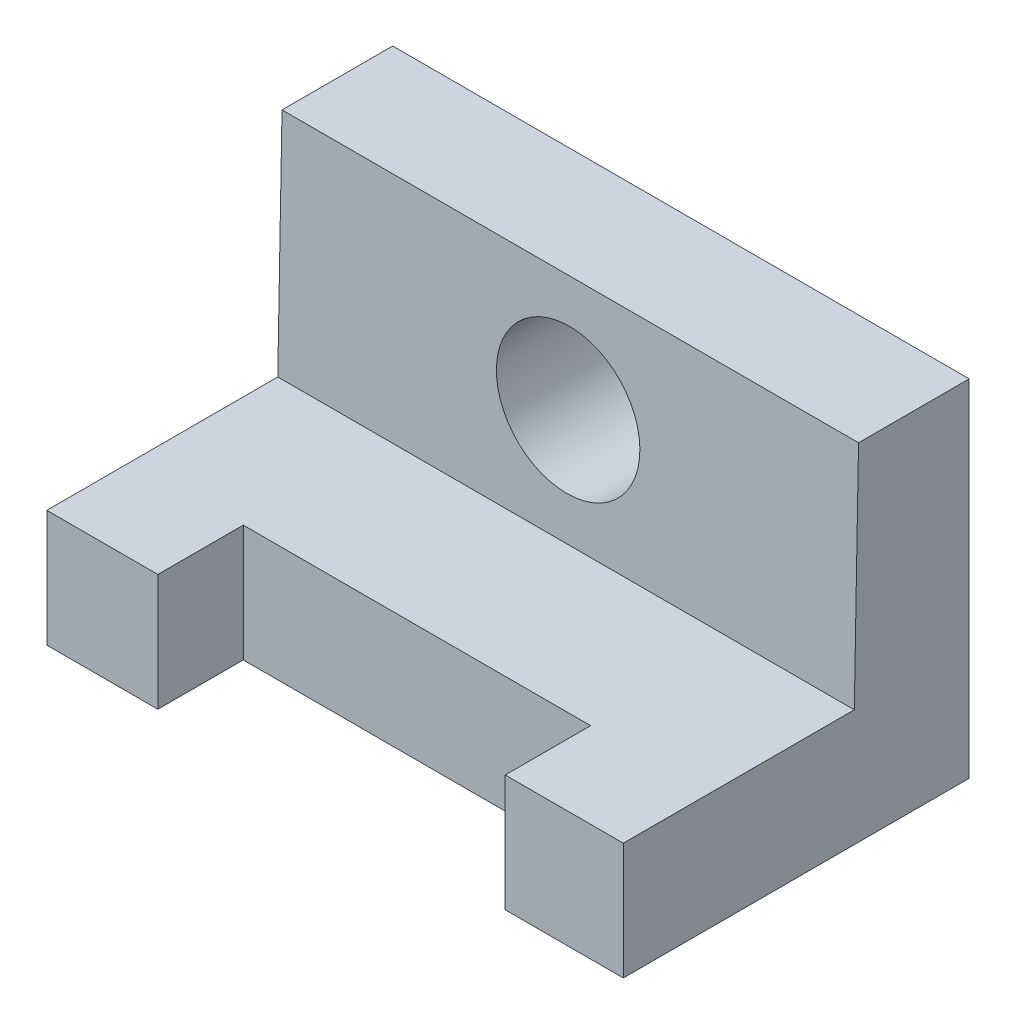
ISO-10303-21;
HEADER;
FILE_DESCRIPTION(('STEP AP214'),'2;1');
FILE_NAME('part.step','',(''),(''),'','','');
FILE_SCHEMA(('AUTOMOTIVE_DESIGN { 1 0 10303 214 1 1 1 1 }'));
ENDSEC;
DATA;
#1=APPLICATION_CONTEXT('core data for automotive mechanical design processes');
#2=APPLICATION_PROTOCOL_DEFINITION('international standard','automotive_design',2000,#1);
#3=PRODUCT_CONTEXT('',#1,'mechanical');
#4=PRODUCT('Part','Part','',(#3));
#5=PRODUCT_RELATED_PRODUCT_CATEGORY('part','',(#4));
#6=PRODUCT_DEFINITION_FORMATION('','',#4);
#7=PRODUCT_DEFINITION_CONTEXT('part definition',#1,'design');
#8=PRODUCT_DEFINITION('design','',#6,#7);
#9=PRODUCT_DEFINITION_SHAPE('','',#8);
#10=(LENGTH_UNIT() NAMED_UNIT(*) SI_UNIT(.MILLI.,.METRE.));
#11=(NAMED_UNIT(*) PLANE_ANGLE_UNIT() SI_UNIT($,.RADIAN.));
#12=(NAMED_UNIT(*) SI_UNIT($,.STERADIAN.) SOLID_ANGLE_UNIT());
#13=UNCERTAINTY_MEASURE_WITH_UNIT(LENGTH_MEASURE(1.E-05),#10,'distance_accuracy_value','');
#14=(GEOMETRIC_REPRESENTATION_CONTEXT(3) GLOBAL_UNCERTAINTY_ASSIGNED_CONTEXT((#13)) GLOBAL_UNIT_ASSIGNED_CONTEXT((#10,
#11,#12)) REPRESENTATION_CONTEXT('',''));
#15=CARTESIAN_POINT('',(0.,0.,0.));
#16=DIRECTION('',(0.,0.,1.));
#17=DIRECTION('',(1.,0.,0.));
#18=AXIS2_PLACEMENT_3D('',#15,#16,#17);
#19=CARTESIAN_POINT('',(100.,-39.7468730431932,60.));
#20=DIRECTION('',(0.,1.,0.));
#21=DIRECTION('',(0.,0.,1.));
#22=AXIS2_PLACEMENT_3D('',#19,#20,#21);
#23=PLANE('',#22);
#24=DIRECTION('',(-1.,0.,0.));
#25=VECTOR('',#24,1.);
#26=CARTESIAN_POINT('',(100.,-39.7468730431932,60.));
#27=LINE('',#26,#25);
#28=CARTESIAN_POINT('',(19.2657676805751,-39.7468730431932,60.));
#29=VERTEX_POINT('',#28);
#30=CARTESIAN_POINT('',(0.,-39.7468730431932,60.));
#31=VERTEX_POINT('',#30);
#32=EDGE_CURVE('E121',#29,#31,#27,.T.);
#33=ORIENTED_EDGE('',*,*,#32,.F.);
#34=DIRECTION('',(0.,0.,-1.));
#35=VECTOR('',#34,1.);
#36=CARTESIAN_POINT('',(19.2657676805751,-39.7468730431932,60.));
#37=LINE('',#36,#35);
#38=CARTESIAN_POINT('',(19.2657676805751,-39.7468730431932,45.1840187500569));
#39=VERTEX_POINT('',#38);
#40=EDGE_CURVE('E203',#29,#39,#37,.T.);
#41=ORIENTED_EDGE('',*,*,#40,.T.);
#42=DIRECTION('',(1.,0.,0.));
#43=VECTOR('',#42,1.);
#44=CARTESIAN_POINT('',(19.2657676805751,-39.7468730431932,45.1840187500569));
#45=LINE('',#44,#43);
#46=CARTESIAN_POINT('',(79.5162951566816,-39.7468730431932,45.1840187500569));
#47=VERTEX_POINT('',#46);
#48=EDGE_CURVE('E186',#39,#47,#45,.T.);
#49=ORIENTED_EDGE('',*,*,#48,.T.);
#50=DIRECTION('',(0.,0.,-1.));
#51=VECTOR('',#50,1.);
#52=CARTESIAN_POINT('',(79.5162951566816,-39.7468730431932,60.));
#53=LINE('',#52,#51);
#54=CARTESIAN_POINT('',(79.5162951566816,-39.7468730431932,60.));
#55=VERTEX_POINT('',#54);
#56=EDGE_CURVE('E211',#55,#47,#53,.T.);
#57=ORIENTED_EDGE('',*,*,#56,.F.);
#58=CARTESIAN_POINT('',(100.,-39.7468730431932,60.));
#59=VERTEX_POINT('',#58);
#60=EDGE_CURVE('E165',#59,#55,#27,.T.);
#61=ORIENTED_EDGE('',*,*,#60,.F.);
#62=DIRECTION('',(0.,0.,-1.));
#63=VECTOR('',#62,1.);
#64=CARTESIAN_POINT('',(100.,-39.7468730431932,60.));
#65=LINE('',#64,#63);
#66=CARTESIAN_POINT('',(100.,-39.7468730431932,19.9353804511396));
#67=VERTEX_POINT('',#66);
#68=EDGE_CURVE('E130',#59,#67,#65,.T.);
#69=ORIENTED_EDGE('',*,*,#68,.T.);
#70=DIRECTION('',(-1.,0.,0.));
#71=VECTOR('',#70,1.);
#72=CARTESIAN_POINT('',(100.,-39.7468730431932,19.9353804511396));
#73=LINE('',#72,#71);
#74=CARTESIAN_POINT('',(0.,-39.7468730431932,19.9353804511396));
#75=VERTEX_POINT('',#74);
#76=EDGE_CURVE('E62',#67,#75,#73,.T.);
#77=ORIENTED_EDGE('',*,*,#76,.T.);
#78=DIRECTION('',(0.,0.,-1.));
#79=VECTOR('',#78,1.);
#80=CARTESIAN_POINT('',(0.,-39.7468730431932,60.));
#81=LINE('',#80,#79);
#82=EDGE_CURVE('E159',#31,#75,#81,.T.);
#83=ORIENTED_EDGE('',*,*,#82,.F.);
#84=EDGE_LOOP('',(#33,#41,#49,#57,#61,#69,#77,#83));
#85=FACE_BOUND('',#84,.T.);
#86=ADVANCED_FACE('F38',(#85),#23,.T.);
#87=CARTESIAN_POINT('',(100.,-60.,60.));
#88=DIRECTION('',(0.,0.,1.));
#89=DIRECTION('',(1.,0.,0.));
#90=AXIS2_PLACEMENT_3D('',#87,#88,#89);
#91=PLANE('',#90);
#92=DIRECTION('',(-1.,0.,0.));
#93=VECTOR('',#92,1.);
#94=CARTESIAN_POINT('',(100.,-60.,60.));
#95=LINE('',#94,#93);
#96=CARTESIAN_POINT('',(19.2657676805751,-60.,60.));
#97=VERTEX_POINT('',#96);
#98=CARTESIAN_POINT('',(0.,-60.,60.));
#99=VERTEX_POINT('',#98);
#100=EDGE_CURVE('E122',#97,#99,#95,.T.);
#101=ORIENTED_EDGE('',*,*,#100,.F.);
#102=DIRECTION('',(0.,1.,0.));
#103=VECTOR('',#102,1.);
#104=CARTESIAN_POINT('',(19.2657676805751,-139.746873043193,60.));
#105=LINE('',#104,#103);
#106=EDGE_CURVE('E210',#97,#29,#105,.T.);
#107=ORIENTED_EDGE('',*,*,#106,.T.);
#108=ORIENTED_EDGE('',*,*,#32,.T.);
#109=DIRECTION('',(0.,1.,0.));
#110=VECTOR('',#109,1.);
#111=CARTESIAN_POINT('',(0.,-60.,60.));
#112=LINE('',#111,#110);
#113=EDGE_CURVE('E156',#99,#31,#112,.T.);
#114=ORIENTED_EDGE('',*,*,#113,.F.);
#115=EDGE_LOOP('',(#101,#107,#108,#114));
#116=FACE_BOUND('',#115,.T.);
#117=ADVANCED_FACE('F208',(#116),#91,.T.);
#118=CARTESIAN_POINT('',(100.,-60.,0.));
#119=DIRECTION('',(0.,-1.,0.));
#120=DIRECTION('',(0.,0.,-1.));
#121=AXIS2_PLACEMENT_3D('',#118,#119,#120);
#122=PLANE('',#121);
#123=DIRECTION('',(-1.,0.,0.));
#124=VECTOR('',#123,1.);
#125=CARTESIAN_POINT('',(100.,-60.,45.1840187500569));
#126=LINE('',#125,#124);
#127=CARTESIAN_POINT('',(79.5162951566816,-60.,45.1840187500569));
#128=VERTEX_POINT('',#127);
#129=CARTESIAN_POINT('',(19.2657676805751,-60.,45.1840187500569));
#130=VERTEX_POINT('',#129);
#131=EDGE_CURVE('E46',#128,#130,#126,.T.);
#132=ORIENTED_EDGE('',*,*,#131,.T.);
#133=DIRECTION('',(0.,0.,1.));
#134=VECTOR('',#133,1.);
#135=CARTESIAN_POINT('',(19.2657676805751,-60.,0.));
#136=LINE('',#135,#134);
#137=EDGE_CURVE('E11',#130,#97,#136,.T.);
#138=ORIENTED_EDGE('',*,*,#137,.T.);
#139=ORIENTED_EDGE('',*,*,#100,.T.);
#140=DIRECTION('',(0.,0.,1.));
#141=VECTOR('',#140,1.);
#142=CARTESIAN_POINT('',(0.,-60.,0.));
#143=LINE('',#142,#141);
#144=CARTESIAN_POINT('',(0.,-60.,0.));
#145=VERTEX_POINT('',#144);
#146=EDGE_CURVE('E153',#145,#99,#143,.T.);
#147=ORIENTED_EDGE('',*,*,#146,.F.);
#148=DIRECTION('',(-1.,0.,0.));
#149=VECTOR('',#148,1.);
#150=CARTESIAN_POINT('',(100.,-60.,0.));
#151=LINE('',#150,#149);
#152=CARTESIAN_POINT('',(100.,-60.,0.));
#153=VERTEX_POINT('',#152);
#154=EDGE_CURVE('E135',#153,#145,#151,.T.);
#155=ORIENTED_EDGE('',*,*,#154,.F.);
#156=DIRECTION('',(0.,0.,1.));
#157=VECTOR('',#156,1.);
#158=CARTESIAN_POINT('',(100.,-60.,0.));
#159=LINE('',#158,#157);
#160=CARTESIAN_POINT('',(100.,-60.,60.));
#161=VERTEX_POINT('',#160);
#162=EDGE_CURVE('E128',#153,#161,#159,.T.);
#163=ORIENTED_EDGE('',*,*,#162,.T.);
#164=CARTESIAN_POINT('',(79.5162951566816,-60.,60.));
#165=VERTEX_POINT('',#164);
#166=EDGE_CURVE('E109',#161,#165,#95,.T.);
#167=ORIENTED_EDGE('',*,*,#166,.T.);
#168=DIRECTION('',(0.,0.,1.));
#169=VECTOR('',#168,1.);
#170=CARTESIAN_POINT('',(79.5162951566816,-60.,0.));
#171=LINE('',#170,#169);
#172=EDGE_CURVE('E164',#128,#165,#171,.T.);
#173=ORIENTED_EDGE('',*,*,#172,.F.);
#174=EDGE_LOOP('',(#132,#138,#139,#147,#155,#163,#167,#173));
#175=FACE_BOUND('',#174,.T.);
#176=ADVANCED_FACE('F133',(#175),#122,.T.);
#177=CARTESIAN_POINT('',(100.,-39.7468730431932,19.9353804511396));
#178=DIRECTION('',(0.,0.0185469827700645,0.99982798992133));
#179=DIRECTION('',(0.,-0.99982798992133,0.0185469827700645));
#180=AXIS2_PLACEMENT_3D('',#177,#178,#179);
#181=PLANE('',#180);
#182=CARTESIAN_POINT('',(50.,-19.8734365215966,19.5667247538961));
#183=DIRECTION('',(0.,0.0185469827700645,0.99982798992133));
#184=DIRECTION('',(0.,-0.99982798992133,0.0185469827700645));
#185=AXIS2_PLACEMENT_3D('',#182,#183,#184);
#186=CIRCLE('',#185,12.4430002100972);
#187=CARTESIAN_POINT('',(50.,-32.3142964102488,19.7975048644007));
#188=VERTEX_POINT('',#187);
#189=EDGE_CURVE('E173',#188,#188,#186,.T.);
#190=ORIENTED_EDGE('',*,*,#189,.F.);
#191=EDGE_LOOP('',(#190));
#192=FACE_BOUND('',#191,.T.);
#193=DIRECTION('',(0.,0.99982798992133,-0.0185469827700645));
#194=VECTOR('',#193,1.);
#195=CARTESIAN_POINT('',(0.,-39.7468730431932,19.9353804511396));
#196=LINE('',#195,#194);
#197=CARTESIAN_POINT('',(0.,0.,19.1980690566526));
#198=VERTEX_POINT('',#197);
#199=EDGE_CURVE('E143',#75,#198,#196,.T.);
#200=ORIENTED_EDGE('',*,*,#199,.F.);
#201=ORIENTED_EDGE('',*,*,#76,.F.);
#202=DIRECTION('',(0.,0.99982798992133,-0.0185469827700645));
#203=VECTOR('',#202,1.);
#204=CARTESIAN_POINT('',(100.,-39.7468730431932,19.9353804511396));
#205=LINE('',#204,#203);
#206=CARTESIAN_POINT('',(100.,0.,19.1980690566526));
#207=VERTEX_POINT('',#206);
#208=EDGE_CURVE('E162',#67,#207,#205,.T.);
#209=ORIENTED_EDGE('',*,*,#208,.T.);
#210=DIRECTION('',(-1.,0.,0.));
#211=VECTOR('',#210,1.);
#212=CARTESIAN_POINT('',(100.,0.,19.1980690566526));
#213=LINE('',#212,#211);
#214=EDGE_CURVE('E95',#207,#198,#213,.T.);
#215=ORIENTED_EDGE('',*,*,#214,.T.);
#216=EDGE_LOOP('',(#200,#201,#209,#215));
#217=FACE_BOUND('',#216,.T.);
#218=ADVANCED_FACE('F40',(#192,#217),#181,.T.);
#219=DIRECTION('',(0.,1.,0.));
#220=VECTOR('',#219,1.);
#221=CARTESIAN_POINT('',(79.5162951566816,-139.746873043193,60.));
#222=LINE('',#221,#220);
#223=EDGE_CURVE('E117',#165,#55,#222,.T.);
#224=ORIENTED_EDGE('',*,*,#223,.F.);
#225=ORIENTED_EDGE('',*,*,#166,.F.);
#226=DIRECTION('',(0.,1.,0.));
#227=VECTOR('',#226,1.);
#228=CARTESIAN_POINT('',(100.,-60.,60.));
#229=LINE('',#228,#227);
#230=EDGE_CURVE('E113',#161,#59,#229,.T.);
#231=ORIENTED_EDGE('',*,*,#230,.T.);
#232=ORIENTED_EDGE('',*,*,#60,.T.);
#233=EDGE_LOOP('',(#224,#225,#231,#232));
#234=FACE_BOUND('',#233,.T.);
#235=ADVANCED_FACE('F111',(#234),#91,.T.);
#236=CARTESIAN_POINT('',(100.,0.,0.));
#237=DIRECTION('',(0.,0.,-1.));
#238=DIRECTION('',(0.,1.,0.));
#239=AXIS2_PLACEMENT_3D('',#236,#237,#238);
#240=PLANE('',#239);
#241=CARTESIAN_POINT('',(50.,-20.2364026623081,0.));
#242=DIRECTION('',(0.,0.,-1.));
#243=DIRECTION('',(0.,1.,0.));
#244=AXIS2_PLACEMENT_3D('',#241,#242,#243);
#245=ELLIPSE('',#244,12.4451408997625,12.4430002100972);
#246=CARTESIAN_POINT('',(50.,-7.79126176254567,0.));
#247=VERTEX_POINT('',#246);
#248=EDGE_CURVE('E147',#247,#247,#245,.T.);
#249=ORIENTED_EDGE('',*,*,#248,.F.);
#250=EDGE_LOOP('',(#249));
#251=FACE_BOUND('',#250,.T.);
#252=DIRECTION('',(0.,-1.,0.));
#253=VECTOR('',#252,1.);
#254=CARTESIAN_POINT('',(0.,0.,0.));
#255=LINE('',#254,#253);
#256=CARTESIAN_POINT('',(0.,0.,0.));
#257=VERTEX_POINT('',#256);
#258=EDGE_CURVE('E150',#257,#145,#255,.T.);
#259=ORIENTED_EDGE('',*,*,#258,.F.);
#260=DIRECTION('',(-1.,0.,0.));
#261=VECTOR('',#260,1.);
#262=CARTESIAN_POINT('',(100.,0.,0.));
#263=LINE('',#262,#261);
#264=CARTESIAN_POINT('',(100.,0.,0.));
#265=VERTEX_POINT('',#264);
#266=EDGE_CURVE('E168',#265,#257,#263,.T.);
#267=ORIENTED_EDGE('',*,*,#266,.F.);
#268=DIRECTION('',(0.,-1.,0.));
#269=VECTOR('',#268,1.);
#270=CARTESIAN_POINT('',(100.,0.,0.));
#271=LINE('',#270,#269);
#272=EDGE_CURVE('E136',#265,#153,#271,.T.);
#273=ORIENTED_EDGE('',*,*,#272,.T.);
#274=ORIENTED_EDGE('',*,*,#154,.T.);
#275=EDGE_LOOP('',(#259,#267,#273,#274));
#276=FACE_BOUND('',#275,.T.);
#277=ADVANCED_FACE('F240',(#251,#276),#240,.T.);
#278=CARTESIAN_POINT('',(100.,0.,19.1980690566526));
#279=DIRECTION('',(0.,1.,0.));
#280=DIRECTION('',(0.,0.,1.));
#281=AXIS2_PLACEMENT_3D('',#278,#279,#280);
#282=PLANE('',#281);
#283=DIRECTION('',(0.,0.,-1.));
#284=VECTOR('',#283,1.);
#285=CARTESIAN_POINT('',(0.,0.,19.1980690566526));
#286=LINE('',#285,#284);
#287=EDGE_CURVE('E146',#198,#257,#286,.T.);
#288=ORIENTED_EDGE('',*,*,#287,.F.);
#289=ORIENTED_EDGE('',*,*,#214,.F.);
#290=DIRECTION('',(0.,0.,-1.));
#291=VECTOR('',#290,1.);
#292=CARTESIAN_POINT('',(100.,0.,19.1980690566526));
#293=LINE('',#292,#291);
#294=EDGE_CURVE('E138',#207,#265,#293,.T.);
#295=ORIENTED_EDGE('',*,*,#294,.T.);
#296=ORIENTED_EDGE('',*,*,#266,.T.);
#297=EDGE_LOOP('',(#288,#289,#295,#296));
#298=FACE_BOUND('',#297,.T.);
#299=ADVANCED_FACE('F196',(#298),#282,.T.);
#300=CARTESIAN_POINT('',(100.,0.,0.));
#301=DIRECTION('',(-1.,0.,0.));
#302=DIRECTION('',(0.,0.,1.));
#303=AXIS2_PLACEMENT_3D('',#300,#301,#302);
#304=PLANE('',#303);
#305=ORIENTED_EDGE('',*,*,#208,.F.);
#306=ORIENTED_EDGE('',*,*,#68,.F.);
#307=ORIENTED_EDGE('',*,*,#230,.F.);
#308=ORIENTED_EDGE('',*,*,#162,.F.);
#309=ORIENTED_EDGE('',*,*,#272,.F.);
#310=ORIENTED_EDGE('',*,*,#294,.F.);
#311=EDGE_LOOP('',(#305,#306,#307,#308,#309,#310));
#312=FACE_BOUND('',#311,.T.);
#313=ADVANCED_FACE('F126',(#312),#304,.F.);
#314=CARTESIAN_POINT('',(0.,0.,0.));
#315=DIRECTION('',(-1.,0.,0.));
#316=DIRECTION('',(0.,0.,1.));
#317=AXIS2_PLACEMENT_3D('',#314,#315,#316);
#318=PLANE('',#317);
#319=ORIENTED_EDGE('',*,*,#199,.T.);
#320=ORIENTED_EDGE('',*,*,#287,.T.);
#321=ORIENTED_EDGE('',*,*,#258,.T.);
#322=ORIENTED_EDGE('',*,*,#146,.T.);
#323=ORIENTED_EDGE('',*,*,#113,.T.);
#324=ORIENTED_EDGE('',*,*,#82,.T.);
#325=EDGE_LOOP('',(#319,#320,#321,#322,#323,#324));
#326=FACE_BOUND('',#325,.T.);
#327=ADVANCED_FACE('F199',(#326),#318,.T.);
#328=CARTESIAN_POINT('',(50.,-21.7281347986031,-80.4160742382369));
#329=DIRECTION('',(0.,0.0185469827700645,0.99982798992133));
#330=DIRECTION('',(0.,-0.99982798992133,0.0185469827700645));
#331=AXIS2_PLACEMENT_3D('',#328,#329,#330);
#332=CYLINDRICAL_SURFACE('',#331,12.4430002100972);
#333=ORIENTED_EDGE('',*,*,#248,.T.);
#334=EDGE_LOOP('',(#333));
#335=FACE_BOUND('',#334,.T.);
#336=ORIENTED_EDGE('',*,*,#189,.T.);
#337=EDGE_LOOP('',(#336));
#338=FACE_BOUND('',#337,.T.);
#339=ADVANCED_FACE('F252',(#335,#338),#332,.F.);
#340=CARTESIAN_POINT('',(19.2657676805751,-139.746873043193,60.));
#341=DIRECTION('',(1.,0.,0.));
#342=DIRECTION('',(0.,0.,-1.));
#343=AXIS2_PLACEMENT_3D('',#340,#341,#342);
#344=PLANE('',#343);
#345=DIRECTION('',(0.,1.,0.));
#346=VECTOR('',#345,1.);
#347=CARTESIAN_POINT('',(19.2657676805751,-139.746873043193,45.1840187500569));
#348=LINE('',#347,#346);
#349=EDGE_CURVE('E183',#130,#39,#348,.T.);
#350=ORIENTED_EDGE('',*,*,#349,.T.);
#351=ORIENTED_EDGE('',*,*,#40,.F.);
#352=ORIENTED_EDGE('',*,*,#106,.F.);
#353=ORIENTED_EDGE('',*,*,#137,.F.);
#354=EDGE_LOOP('',(#350,#351,#352,#353));
#355=FACE_BOUND('',#354,.T.);
#356=ADVANCED_FACE('F227',(#355),#344,.T.);
#357=CARTESIAN_POINT('',(19.2657676805751,-139.746873043193,45.1840187500569));
#358=DIRECTION('',(0.,0.,1.));
#359=DIRECTION('',(1.,0.,0.));
#360=AXIS2_PLACEMENT_3D('',#357,#358,#359);
#361=PLANE('',#360);
#362=DIRECTION('',(0.,1.,0.));
#363=VECTOR('',#362,1.);
#364=CARTESIAN_POINT('',(79.5162951566816,-139.746873043193,45.1840187500569));
#365=LINE('',#364,#363);
#366=EDGE_CURVE('E53',#128,#47,#365,.T.);
#367=ORIENTED_EDGE('',*,*,#366,.T.);
#368=ORIENTED_EDGE('',*,*,#48,.F.);
#369=ORIENTED_EDGE('',*,*,#349,.F.);
#370=ORIENTED_EDGE('',*,*,#131,.F.);
#371=EDGE_LOOP('',(#367,#368,#369,#370));
#372=FACE_BOUND('',#371,.T.);
#373=ADVANCED_FACE('F179',(#372),#361,.T.);
#374=CARTESIAN_POINT('',(79.5162951566816,-139.746873043193,60.));
#375=DIRECTION('',(1.,0.,0.));
#376=DIRECTION('',(0.,0.,-1.));
#377=AXIS2_PLACEMENT_3D('',#374,#375,#376);
#378=PLANE('',#377);
#379=ORIENTED_EDGE('',*,*,#172,.T.);
#380=ORIENTED_EDGE('',*,*,#223,.T.);
#381=ORIENTED_EDGE('',*,*,#56,.T.);
#382=ORIENTED_EDGE('',*,*,#366,.F.);
#383=EDGE_LOOP('',(#379,#380,#381,#382));
#384=FACE_BOUND('',#383,.T.);
#385=ADVANCED_FACE('F221',(#384),#378,.F.);
#386=CLOSED_SHELL('',(#86,#117,#176,#218,#235,#277,#299,#313,#327,#339,#356,#373,#385));
#387=MANIFOLD_SOLID_BREP('B2',#386);
#388=ADVANCED_BREP_SHAPE_REPRESENTATION('',(#18,#387),#14);
#389=SHAPE_DEFINITION_REPRESENTATION(#9,#388);
ENDSEC;
END-ISO-10303-21;
